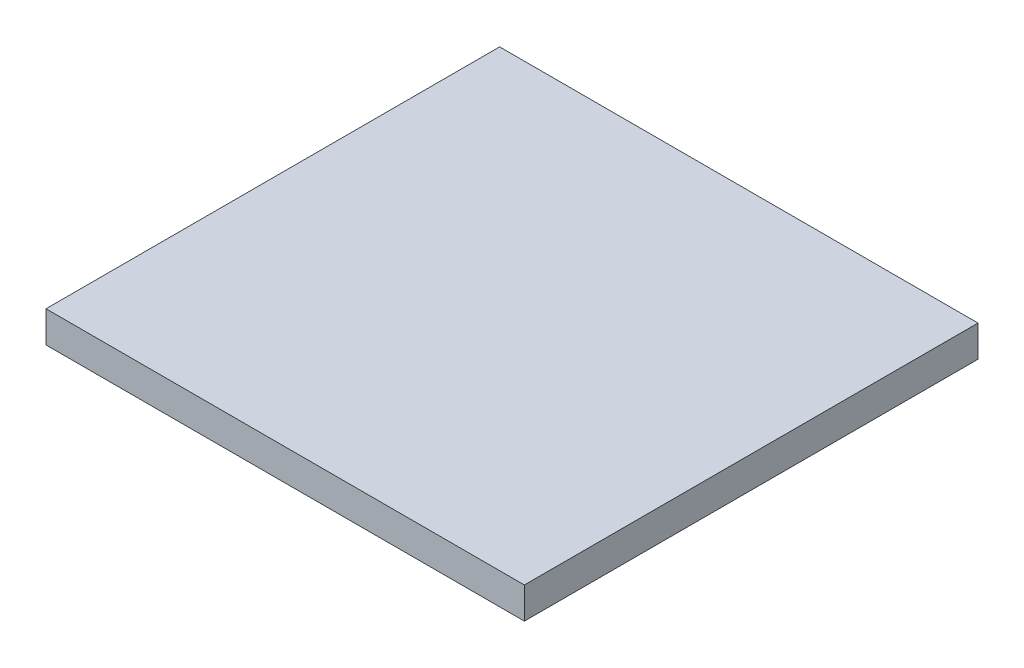
ISO-10303-21;
HEADER;
FILE_DESCRIPTION(('STEP AP214'),'2;1');
FILE_NAME('part.step','',(''),(''),'','','');
FILE_SCHEMA(('AUTOMOTIVE_DESIGN { 1 0 10303 214 1 1 1 1 }'));
ENDSEC;
DATA;
#1=APPLICATION_CONTEXT('core data for automotive mechanical design processes');
#2=APPLICATION_PROTOCOL_DEFINITION('international standard','automotive_design',2000,#1);
#3=PRODUCT_CONTEXT('',#1,'mechanical');
#4=PRODUCT('Part','Part','',(#3));
#5=PRODUCT_RELATED_PRODUCT_CATEGORY('part','',(#4));
#6=PRODUCT_DEFINITION_FORMATION('','',#4);
#7=PRODUCT_DEFINITION_CONTEXT('part definition',#1,'design');
#8=PRODUCT_DEFINITION('design','',#6,#7);
#9=PRODUCT_DEFINITION_SHAPE('','',#8);
#10=(LENGTH_UNIT() NAMED_UNIT(*) SI_UNIT(.MILLI.,.METRE.));
#11=(NAMED_UNIT(*) PLANE_ANGLE_UNIT() SI_UNIT($,.RADIAN.));
#12=(NAMED_UNIT(*) SI_UNIT($,.STERADIAN.) SOLID_ANGLE_UNIT());
#13=UNCERTAINTY_MEASURE_WITH_UNIT(LENGTH_MEASURE(1.E-05),#10,'distance_accuracy_value','');
#14=(GEOMETRIC_REPRESENTATION_CONTEXT(3) GLOBAL_UNCERTAINTY_ASSIGNED_CONTEXT((#13)) GLOBAL_UNIT_ASSIGNED_CONTEXT((#10,
#11,#12)) REPRESENTATION_CONTEXT('',''));
#15=CARTESIAN_POINT('',(0.,0.,0.));
#16=DIRECTION('',(0.,0.,1.));
#17=DIRECTION('',(1.,0.,0.));
#18=AXIS2_PLACEMENT_3D('',#15,#16,#17);
#19=CARTESIAN_POINT('',(60.,1080.,-580.));
#20=DIRECTION('',(-1.,0.,0.));
#21=DIRECTION('',(0.,0.,1.));
#22=AXIS2_PLACEMENT_3D('',#19,#20,#21);
#23=PLANE('',#22);
#24=DIRECTION('',(0.,-1.,0.));
#25=VECTOR('',#24,1.);
#26=CARTESIAN_POINT('',(60.,1080.,-30.));
#27=LINE('',#26,#25);
#28=CARTESIAN_POINT('',(60.,1118.,-30.));
#29=VERTEX_POINT('',#28);
#30=CARTESIAN_POINT('',(60.,1080.,-30.));
#31=VERTEX_POINT('',#30);
#32=EDGE_CURVE('E103',#29,#31,#27,.T.);
#33=ORIENTED_EDGE('',*,*,#32,.F.);
#34=DIRECTION('',(0.,0.,1.));
#35=VECTOR('',#34,1.);
#36=CARTESIAN_POINT('',(60.,1118.,-580.));
#37=LINE('',#36,#35);
#38=CARTESIAN_POINT('',(60.,1118.,-580.));
#39=VERTEX_POINT('',#38);
#40=EDGE_CURVE('E11',#39,#29,#37,.T.);
#41=ORIENTED_EDGE('',*,*,#40,.F.);
#42=DIRECTION('',(0.,-1.,0.));
#43=VECTOR('',#42,1.);
#44=CARTESIAN_POINT('',(60.,1080.,-580.));
#45=LINE('',#44,#43);
#46=CARTESIAN_POINT('',(60.,1080.,-580.));
#47=VERTEX_POINT('',#46);
#48=EDGE_CURVE('E97',#39,#47,#45,.T.);
#49=ORIENTED_EDGE('',*,*,#48,.T.);
#50=DIRECTION('',(0.,0.,1.));
#51=VECTOR('',#50,1.);
#52=CARTESIAN_POINT('',(60.,1080.,-580.));
#53=LINE('',#52,#51);
#54=EDGE_CURVE('E42',#47,#31,#53,.T.);
#55=ORIENTED_EDGE('',*,*,#54,.T.);
#56=EDGE_LOOP('',(#33,#41,#49,#55));
#57=FACE_BOUND('',#56,.T.);
#58=ADVANCED_FACE('F39',(#57),#23,.T.);
#59=CARTESIAN_POINT('',(60.,1118.,-580.));
#60=DIRECTION('',(0.,1.,0.));
#61=DIRECTION('',(0.,0.,1.));
#62=AXIS2_PLACEMENT_3D('',#59,#60,#61);
#63=PLANE('',#62);
#64=DIRECTION('',(-1.,0.,0.));
#65=VECTOR('',#64,1.);
#66=CARTESIAN_POINT('',(60.,1118.,-30.));
#67=LINE('',#66,#65);
#68=CARTESIAN_POINT('',(640.,1118.,-30.));
#69=VERTEX_POINT('',#68);
#70=EDGE_CURVE('E99',#69,#29,#67,.T.);
#71=ORIENTED_EDGE('',*,*,#70,.F.);
#72=DIRECTION('',(0.,0.,1.));
#73=VECTOR('',#72,1.);
#74=CARTESIAN_POINT('',(640.,1118.,-580.));
#75=LINE('',#74,#73);
#76=CARTESIAN_POINT('',(640.,1118.,-580.));
#77=VERTEX_POINT('',#76);
#78=EDGE_CURVE('E48',#77,#69,#75,.T.);
#79=ORIENTED_EDGE('',*,*,#78,.F.);
#80=DIRECTION('',(-1.,0.,0.));
#81=VECTOR('',#80,1.);
#82=CARTESIAN_POINT('',(60.,1118.,-580.));
#83=LINE('',#82,#81);
#84=EDGE_CURVE('E94',#77,#39,#83,.T.);
#85=ORIENTED_EDGE('',*,*,#84,.T.);
#86=ORIENTED_EDGE('',*,*,#40,.T.);
#87=EDGE_LOOP('',(#71,#79,#85,#86));
#88=FACE_BOUND('',#87,.T.);
#89=ADVANCED_FACE('F113',(#88),#63,.T.);
#90=CARTESIAN_POINT('',(640.,1080.,-580.));
#91=DIRECTION('',(1.,0.,0.));
#92=DIRECTION('',(0.,0.,-1.));
#93=AXIS2_PLACEMENT_3D('',#90,#91,#92);
#94=PLANE('',#93);
#95=DIRECTION('',(0.,1.,0.));
#96=VECTOR('',#95,1.);
#97=CARTESIAN_POINT('',(640.,1080.,-30.));
#98=LINE('',#97,#96);
#99=CARTESIAN_POINT('',(640.,1080.,-30.));
#100=VERTEX_POINT('',#99);
#101=EDGE_CURVE('E89',#100,#69,#98,.T.);
#102=ORIENTED_EDGE('',*,*,#101,.F.);
#103=DIRECTION('',(0.,0.,1.));
#104=VECTOR('',#103,1.);
#105=CARTESIAN_POINT('',(640.,1080.,-580.));
#106=LINE('',#105,#104);
#107=CARTESIAN_POINT('',(640.,1080.,-580.));
#108=VERTEX_POINT('',#107);
#109=EDGE_CURVE('E84',#108,#100,#106,.T.);
#110=ORIENTED_EDGE('',*,*,#109,.F.);
#111=DIRECTION('',(0.,1.,0.));
#112=VECTOR('',#111,1.);
#113=CARTESIAN_POINT('',(640.,1080.,-580.));
#114=LINE('',#113,#112);
#115=EDGE_CURVE('E87',#108,#77,#114,.T.);
#116=ORIENTED_EDGE('',*,*,#115,.T.);
#117=ORIENTED_EDGE('',*,*,#78,.T.);
#118=EDGE_LOOP('',(#102,#110,#116,#117));
#119=FACE_BOUND('',#118,.T.);
#120=ADVANCED_FACE('F86',(#119),#94,.T.);
#121=CARTESIAN_POINT('',(60.,1080.,-580.));
#122=DIRECTION('',(0.,-1.,0.));
#123=DIRECTION('',(0.,0.,-1.));
#124=AXIS2_PLACEMENT_3D('',#121,#122,#123);
#125=PLANE('',#124);
#126=DIRECTION('',(1.,0.,0.));
#127=VECTOR('',#126,1.);
#128=CARTESIAN_POINT('',(60.,1080.,-30.));
#129=LINE('',#128,#127);
#130=EDGE_CURVE('E106',#31,#100,#129,.T.);
#131=ORIENTED_EDGE('',*,*,#130,.F.);
#132=ORIENTED_EDGE('',*,*,#54,.F.);
#133=DIRECTION('',(1.,0.,0.));
#134=VECTOR('',#133,1.);
#135=CARTESIAN_POINT('',(60.,1080.,-580.));
#136=LINE('',#135,#134);
#137=EDGE_CURVE('E93',#47,#108,#136,.T.);
#138=ORIENTED_EDGE('',*,*,#137,.T.);
#139=ORIENTED_EDGE('',*,*,#109,.T.);
#140=EDGE_LOOP('',(#131,#132,#138,#139));
#141=FACE_BOUND('',#140,.T.);
#142=ADVANCED_FACE('F96',(#141),#125,.T.);
#143=CARTESIAN_POINT('',(0.,0.,-580.));
#144=DIRECTION('',(0.,0.,-1.));
#145=DIRECTION('',(-1.,0.,0.));
#146=AXIS2_PLACEMENT_3D('',#143,#144,#145);
#147=PLANE('',#146);
#148=ORIENTED_EDGE('',*,*,#48,.F.);
#149=ORIENTED_EDGE('',*,*,#84,.F.);
#150=ORIENTED_EDGE('',*,*,#115,.F.);
#151=ORIENTED_EDGE('',*,*,#137,.F.);
#152=EDGE_LOOP('',(#148,#149,#150,#151));
#153=FACE_BOUND('',#152,.T.);
#154=ADVANCED_FACE('F92',(#153),#147,.T.);
#155=CARTESIAN_POINT('',(0.,0.,-30.));
#156=DIRECTION('',(0.,0.,-1.));
#157=DIRECTION('',(-1.,0.,0.));
#158=AXIS2_PLACEMENT_3D('',#155,#156,#157);
#159=PLANE('',#158);
#160=ORIENTED_EDGE('',*,*,#32,.T.);
#161=ORIENTED_EDGE('',*,*,#130,.T.);
#162=ORIENTED_EDGE('',*,*,#101,.T.);
#163=ORIENTED_EDGE('',*,*,#70,.T.);
#164=EDGE_LOOP('',(#160,#161,#162,#163));
#165=FACE_BOUND('',#164,.T.);
#166=ADVANCED_FACE('F112',(#165),#159,.F.);
#167=CLOSED_SHELL('',(#58,#89,#120,#142,#154,#166));
#168=MANIFOLD_SOLID_BREP('B2',#167);
#169=ADVANCED_BREP_SHAPE_REPRESENTATION('',(#18,#168),#14);
#170=SHAPE_DEFINITION_REPRESENTATION(#9,#169);
ENDSEC;
END-ISO-10303-21;
